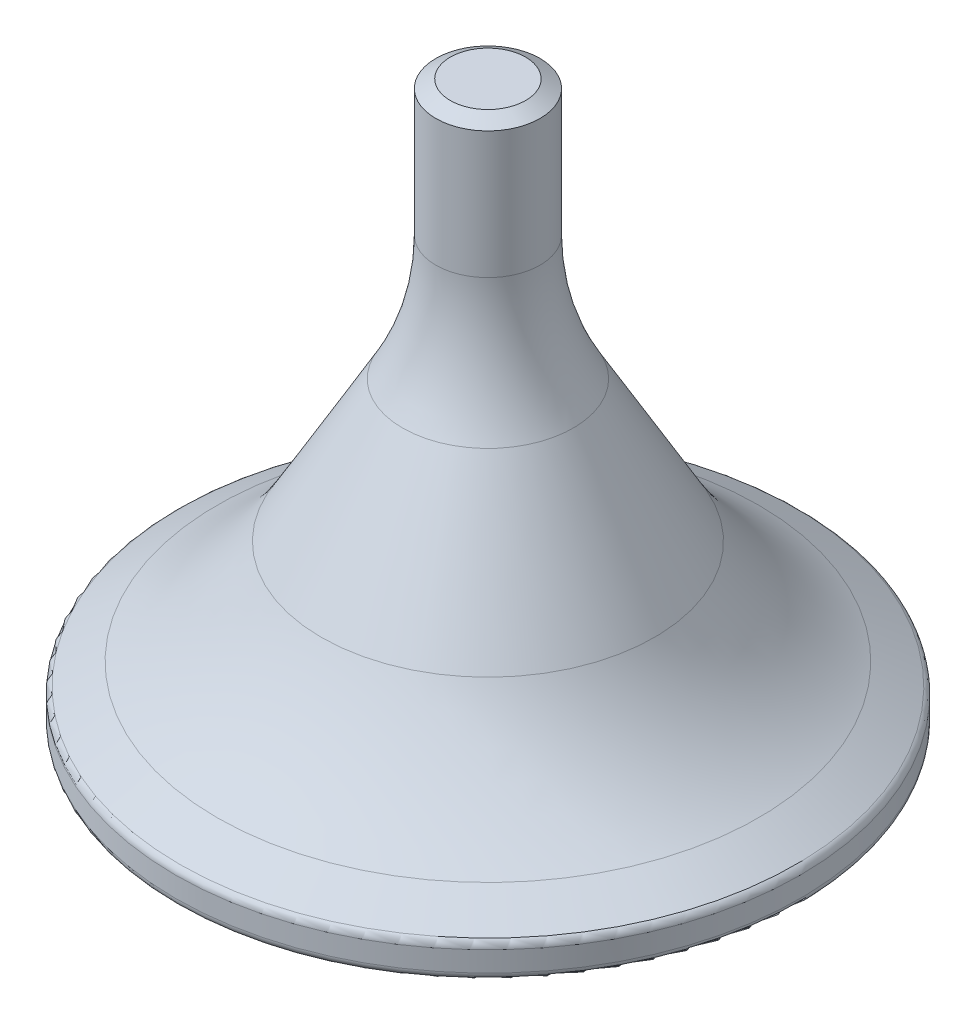
ISO-10303-21;
HEADER;
FILE_DESCRIPTION(('STEP AP214'),'2;1');
FILE_NAME('part.step','',(''),(''),'','','');
FILE_SCHEMA(('AUTOMOTIVE_DESIGN { 1 0 10303 214 1 1 1 1 }'));
ENDSEC;
DATA;
#1=APPLICATION_CONTEXT('core data for automotive mechanical design processes');
#2=APPLICATION_PROTOCOL_DEFINITION('international standard','automotive_design',2000,#1);
#3=PRODUCT_CONTEXT('',#1,'mechanical');
#4=PRODUCT('Part','Part','',(#3));
#5=PRODUCT_RELATED_PRODUCT_CATEGORY('part','',(#4));
#6=PRODUCT_DEFINITION_FORMATION('','',#4);
#7=PRODUCT_DEFINITION_CONTEXT('part definition',#1,'design');
#8=PRODUCT_DEFINITION('design','',#6,#7);
#9=PRODUCT_DEFINITION_SHAPE('','',#8);
#10=(LENGTH_UNIT() NAMED_UNIT(*) SI_UNIT(.MILLI.,.METRE.));
#11=(NAMED_UNIT(*) PLANE_ANGLE_UNIT() SI_UNIT($,.RADIAN.));
#12=(NAMED_UNIT(*) SI_UNIT($,.STERADIAN.) SOLID_ANGLE_UNIT());
#13=UNCERTAINTY_MEASURE_WITH_UNIT(LENGTH_MEASURE(1.E-05),#10,'distance_accuracy_value','');
#14=(GEOMETRIC_REPRESENTATION_CONTEXT(3) GLOBAL_UNCERTAINTY_ASSIGNED_CONTEXT((#13)) GLOBAL_UNIT_ASSIGNED_CONTEXT((#10,
#11,#12)) REPRESENTATION_CONTEXT('',''));
#15=CARTESIAN_POINT('',(0.,0.,0.));
#16=DIRECTION('',(0.,0.,1.));
#17=DIRECTION('',(1.,0.,0.));
#18=AXIS2_PLACEMENT_3D('',#15,#16,#17);
#19=CARTESIAN_POINT('',(0.,-34.2658445746104,-19.05));
#20=DIRECTION('',(0.,1.,0.));
#21=DIRECTION('',(0.,0.,1.));
#22=AXIS2_PLACEMENT_3D('',#19,#20,#21);
#23=PLANE('',#22);
#24=CARTESIAN_POINT('',(-7.9375,-34.2658445746104,0.));
#25=DIRECTION('',(0.,1.,0.));
#26=DIRECTION('',(0.,0.,1.));
#27=AXIS2_PLACEMENT_3D('',#24,#25,#26);
#28=CIRCLE('',#27,1.5875);
#29=CARTESIAN_POINT('',(-7.9375,-34.2658445746104,-1.5875));
#30=VERTEX_POINT('',#29);
#31=CARTESIAN_POINT('',(-9.525,-34.2658445746104,0.));
#32=VERTEX_POINT('',#31);
#33=EDGE_CURVE('E63',#30,#32,#28,.T.);
#34=ORIENTED_EDGE('',*,*,#33,.T.);
#35=CARTESIAN_POINT('',(-7.9375,-34.2658445746104,0.));
#36=DIRECTION('',(0.,1.,0.));
#37=DIRECTION('',(0.,0.,1.));
#38=AXIS2_PLACEMENT_3D('',#35,#36,#37);
#39=CIRCLE('',#38,1.5875);
#40=CARTESIAN_POINT('',(-7.9375,-34.2658445746104,1.5875));
#41=VERTEX_POINT('',#40);
#42=EDGE_CURVE('E11',#32,#41,#39,.T.);
#43=ORIENTED_EDGE('',*,*,#42,.T.);
#44=DIRECTION('',(-1.,0.,0.));
#45=VECTOR('',#44,1.);
#46=CARTESIAN_POINT('',(-9.525,-34.2658445746104,1.5875));
#47=LINE('',#46,#45);
#48=CARTESIAN_POINT('',(7.93749999999999,-34.2658445746104,1.5875));
#49=VERTEX_POINT('',#48);
#50=EDGE_CURVE('E117',#49,#41,#47,.T.);
#51=ORIENTED_EDGE('',*,*,#50,.F.);
#52=CARTESIAN_POINT('',(7.9375,-34.2658445746104,0.));
#53=DIRECTION('',(0.,1.,0.));
#54=DIRECTION('',(0.,0.,1.));
#55=AXIS2_PLACEMENT_3D('',#52,#53,#54);
#56=CIRCLE('',#55,1.5875);
#57=CARTESIAN_POINT('',(9.525,-34.2658445746104,0.));
#58=VERTEX_POINT('',#57);
#59=EDGE_CURVE('E50',#49,#58,#56,.T.);
#60=ORIENTED_EDGE('',*,*,#59,.T.);
#61=CARTESIAN_POINT('',(7.9375,-34.2658445746104,0.));
#62=DIRECTION('',(0.,1.,0.));
#63=DIRECTION('',(0.,0.,1.));
#64=AXIS2_PLACEMENT_3D('',#61,#62,#63);
#65=CIRCLE('',#64,1.5875);
#66=CARTESIAN_POINT('',(7.93749999999999,-34.2658445746104,-1.5875));
#67=VERTEX_POINT('',#66);
#68=EDGE_CURVE('E100',#58,#67,#65,.T.);
#69=ORIENTED_EDGE('',*,*,#68,.T.);
#70=DIRECTION('',(1.,0.,0.));
#71=VECTOR('',#70,1.);
#72=CARTESIAN_POINT('',(-9.525,-34.2658445746104,-1.5875));
#73=LINE('',#72,#71);
#74=EDGE_CURVE('E108',#30,#67,#73,.T.);
#75=ORIENTED_EDGE('',*,*,#74,.F.);
#76=EDGE_LOOP('',(#34,#43,#51,#60,#69,#75));
#77=FACE_BOUND('',#76,.T.);
#78=CARTESIAN_POINT('',(0.,-34.2658445746104,0.));
#79=DIRECTION('',(0.,1.,0.));
#80=DIRECTION('',(0.,0.,1.));
#81=AXIS2_PLACEMENT_3D('',#78,#79,#80);
#82=CIRCLE('',#81,18.542);
#83=CARTESIAN_POINT('',(0.,-34.2658445746104,18.542));
#84=VERTEX_POINT('',#83);
#85=EDGE_CURVE('E143',#84,#84,#82,.F.);
#86=ORIENTED_EDGE('',*,*,#85,.T.);
#87=EDGE_LOOP('',(#86));
#88=FACE_BOUND('',#87,.T.);
#89=ADVANCED_FACE('F41',(#77,#88),#23,.F.);
#90=CARTESIAN_POINT('',(0.,0.,0.));
#91=DIRECTION('',(0.,1.,0.));
#92=DIRECTION('',(0.,0.,1.));
#93=AXIS2_PLACEMENT_3D('',#90,#91,#92);
#94=CYLINDRICAL_SURFACE('',#93,19.05);
#95=CARTESIAN_POINT('',(0.,-33.7578445746104,0.));
#96=DIRECTION('',(0.,1.,0.));
#97=DIRECTION('',(0.,0.,1.));
#98=AXIS2_PLACEMENT_3D('',#95,#96,#97);
#99=CIRCLE('',#98,19.05);
#100=CARTESIAN_POINT('',(0.,-33.7578445746104,19.05));
#101=VERTEX_POINT('',#100);
#102=EDGE_CURVE('E140',#101,#101,#99,.T.);
#103=ORIENTED_EDGE('',*,*,#102,.T.);
#104=EDGE_LOOP('',(#103));
#105=FACE_BOUND('',#104,.T.);
#106=CARTESIAN_POINT('',(0.,-32.5271385113588,0.));
#107=DIRECTION('',(0.,-1.,0.));
#108=DIRECTION('',(0.,0.,-1.));
#109=AXIS2_PLACEMENT_3D('',#106,#107,#108);
#110=CIRCLE('',#109,19.05);
#111=CARTESIAN_POINT('',(0.,-32.5271385113588,-19.05));
#112=VERTEX_POINT('',#111);
#113=EDGE_CURVE('E137',#112,#112,#110,.T.);
#114=ORIENTED_EDGE('',*,*,#113,.T.);
#115=EDGE_LOOP('',(#114));
#116=FACE_BOUND('',#115,.T.);
#117=ADVANCED_FACE('F192',(#105,#116),#94,.T.);
#118=CARTESIAN_POINT('',(0.,-32.2338445746104,0.));
#119=DIRECTION('',(0.,-1.,0.));
#120=DIRECTION('',(0.,0.,-1.));
#121=AXIS2_PLACEMENT_3D('',#118,#119,#120);
#122=CONICAL_SURFACE('',#121,19.05,1.0471975511966);
#123=CARTESIAN_POINT('',(0.,-32.0871976062363,0.));
#124=DIRECTION('',(0.,1.,0.));
#125=DIRECTION('',(0.,0.,1.));
#126=AXIS2_PLACEMENT_3D('',#123,#124,#125);
#127=CIRCLE('',#126,18.796);
#128=CARTESIAN_POINT('',(0.,-32.0871976062363,18.796));
#129=VERTEX_POINT('',#128);
#130=EDGE_CURVE('E146',#129,#129,#127,.T.);
#131=ORIENTED_EDGE('',*,*,#130,.T.);
#132=EDGE_LOOP('',(#131));
#133=FACE_BOUND('',#132,.T.);
#134=CARTESIAN_POINT('',(0.,-30.7673748908688,0.));
#135=DIRECTION('',(0.,1.,0.));
#136=DIRECTION('',(0.,0.,1.));
#137=AXIS2_PLACEMENT_3D('',#134,#135,#136);
#138=CIRCLE('',#137,16.51);
#139=CARTESIAN_POINT('',(0.,-30.7673748908688,16.51));
#140=VERTEX_POINT('',#139);
#141=EDGE_CURVE('E134',#140,#140,#138,.T.);
#142=ORIENTED_EDGE('',*,*,#141,.F.);
#143=EDGE_LOOP('',(#142));
#144=FACE_BOUND('',#143,.T.);
#145=ADVANCED_FACE('F199',(#133,#144),#122,.T.);
#146=CARTESIAN_POINT('',(0.,-15.7431135768379,0.));
#147=DIRECTION('',(0.,1.,0.));
#148=DIRECTION('',(0.,0.,1.));
#149=AXIS2_PLACEMENT_3D('',#146,#147,#148);
#150=TOROIDAL_SURFACE('',#149,25.1842613140309,17.348522628062);
#151=CARTESIAN_POINT('',(0.,-24.4173748908688,0.));
#152=DIRECTION('',(0.,1.,0.));
#153=DIRECTION('',(0.,0.,1.));
#154=AXIS2_PLACEMENT_3D('',#151,#152,#153);
#155=CIRCLE('',#154,10.16);
#156=CARTESIAN_POINT('',(0.,-24.4173748908688,10.16));
#157=VERTEX_POINT('',#156);
#158=EDGE_CURVE('E131',#157,#157,#155,.T.);
#159=ORIENTED_EDGE('',*,*,#158,.F.);
#160=EDGE_LOOP('',(#159));
#161=FACE_BOUND('',#160,.T.);
#162=ORIENTED_EDGE('',*,*,#141,.T.);
#163=EDGE_LOOP('',(#162));
#164=FACE_BOUND('',#163,.T.);
#165=ADVANCED_FACE('F242',(#161,#164),#150,.F.);
#166=CARTESIAN_POINT('',(0.,-24.4173748908688,0.));
#167=DIRECTION('',(0.,-1.,0.));
#168=DIRECTION('',(0.,0.,-1.));
#169=AXIS2_PLACEMENT_3D('',#166,#167,#168);
#170=CONICAL_SURFACE('',#169,10.16,0.523598775598293);
#171=CARTESIAN_POINT('',(0.,-15.83852724098,0.));
#172=DIRECTION('',(0.,1.,0.));
#173=DIRECTION('',(0.,0.,1.));
#174=AXIS2_PLACEMENT_3D('',#171,#172,#173);
#175=CIRCLE('',#174,5.20699999999999);
#176=CARTESIAN_POINT('',(0.,-15.83852724098,5.20699999999999));
#177=VERTEX_POINT('',#176);
#178=EDGE_CURVE('E128',#177,#177,#175,.T.);
#179=ORIENTED_EDGE('',*,*,#178,.F.);
#180=EDGE_LOOP('',(#179));
#181=FACE_BOUND('',#180,.T.);
#182=ORIENTED_EDGE('',*,*,#158,.T.);
#183=EDGE_LOOP('',(#182));
#184=FACE_BOUND('',#183,.T.);
#185=ADVANCED_FACE('F238',(#181,#184),#170,.T.);
#186=CARTESIAN_POINT('',(0.,-8.25499999999998,0.));
#187=DIRECTION('',(0.,1.,0.));
#188=DIRECTION('',(0.,0.,1.));
#189=AXIS2_PLACEMENT_3D('',#186,#187,#188);
#190=TOROIDAL_SURFACE('',#189,18.3420544819603,15.1670544819603);
#191=CARTESIAN_POINT('',(0.,-8.255,0.));
#192=DIRECTION('',(0.,1.,0.));
#193=DIRECTION('',(0.,0.,1.));
#194=AXIS2_PLACEMENT_3D('',#191,#192,#193);
#195=CIRCLE('',#194,3.175);
#196=CARTESIAN_POINT('',(0.,-8.255,3.175));
#197=VERTEX_POINT('',#196);
#198=EDGE_CURVE('E125',#197,#197,#195,.T.);
#199=ORIENTED_EDGE('',*,*,#198,.F.);
#200=EDGE_LOOP('',(#199));
#201=FACE_BOUND('',#200,.T.);
#202=ORIENTED_EDGE('',*,*,#178,.T.);
#203=EDGE_LOOP('',(#202));
#204=FACE_BOUND('',#203,.T.);
#205=ADVANCED_FACE('F231',(#201,#204),#190,.F.);
#206=CARTESIAN_POINT('',(0.,0.,0.));
#207=DIRECTION('',(0.,1.,0.));
#208=DIRECTION('',(0.,0.,1.));
#209=AXIS2_PLACEMENT_3D('',#206,#207,#208);
#210=CYLINDRICAL_SURFACE('',#209,3.175);
#211=CARTESIAN_POINT('',(0.,-0.507999999999998,0.));
#212=DIRECTION('',(0.,-1.,0.));
#213=DIRECTION('',(0.,0.,-1.));
#214=AXIS2_PLACEMENT_3D('',#211,#212,#213);
#215=CIRCLE('',#214,3.175);
#216=CARTESIAN_POINT('',(0.,-0.507999999999998,-3.175));
#217=VERTEX_POINT('',#216);
#218=EDGE_CURVE('E152',#217,#217,#215,.T.);
#219=ORIENTED_EDGE('',*,*,#218,.T.);
#220=EDGE_LOOP('',(#219));
#221=FACE_BOUND('',#220,.T.);
#222=ORIENTED_EDGE('',*,*,#198,.T.);
#223=EDGE_LOOP('',(#222));
#224=FACE_BOUND('',#223,.T.);
#225=ADVANCED_FACE('F226',(#221,#224),#210,.T.);
#226=CARTESIAN_POINT('',(0.,0.,0.));
#227=DIRECTION('',(0.,-1.,0.));
#228=DIRECTION('',(0.,0.,-1.));
#229=AXIS2_PLACEMENT_3D('',#226,#227,#228);
#230=PLANE('',#229);
#231=CARTESIAN_POINT('',(0.,0.,0.));
#232=DIRECTION('',(0.,-1.,0.));
#233=DIRECTION('',(0.,0.,-1.));
#234=AXIS2_PLACEMENT_3D('',#231,#232,#233);
#235=CIRCLE('',#234,2.29511818975501);
#236=CARTESIAN_POINT('',(0.,0.,-2.29511818975501));
#237=VERTEX_POINT('',#236);
#238=EDGE_CURVE('E149',#237,#237,#235,.F.);
#239=ORIENTED_EDGE('',*,*,#238,.T.);
#240=EDGE_LOOP('',(#239));
#241=FACE_BOUND('',#240,.T.);
#242=ADVANCED_FACE('F208',(#241),#230,.F.);
#243=CARTESIAN_POINT('',(0.,-33.7578445746104,0.));
#244=DIRECTION('',(0.,1.,0.));
#245=DIRECTION('',(0.,0.,1.));
#246=AXIS2_PLACEMENT_3D('',#243,#244,#245);
#247=TOROIDAL_SURFACE('',#246,18.542,0.508);
#248=ORIENTED_EDGE('',*,*,#85,.F.);
#249=EDGE_LOOP('',(#248));
#250=FACE_BOUND('',#249,.T.);
#251=ORIENTED_EDGE('',*,*,#102,.F.);
#252=EDGE_LOOP('',(#251));
#253=FACE_BOUND('',#252,.T.);
#254=ADVANCED_FACE('F204',(#250,#253),#247,.T.);
#255=CARTESIAN_POINT('',(0.,-32.5271385113588,0.));
#256=DIRECTION('',(0.,-1.,0.));
#257=DIRECTION('',(0.,0.,-1.));
#258=AXIS2_PLACEMENT_3D('',#255,#256,#257);
#259=TOROIDAL_SURFACE('',#258,18.542,0.508);
#260=ORIENTED_EDGE('',*,*,#113,.F.);
#261=EDGE_LOOP('',(#260));
#262=FACE_BOUND('',#261,.T.);
#263=ORIENTED_EDGE('',*,*,#130,.F.);
#264=EDGE_LOOP('',(#263));
#265=FACE_BOUND('',#264,.T.);
#266=ADVANCED_FACE('F207',(#262,#265),#259,.T.);
#267=CARTESIAN_POINT('',(0.,0.,0.));
#268=DIRECTION('',(0.,-1.,0.));
#269=DIRECTION('',(0.,0.,-1.));
#270=AXIS2_PLACEMENT_3D('',#267,#268,#269);
#271=CONICAL_SURFACE('',#270,2.29511818975501,1.0471975511966);
#272=ORIENTED_EDGE('',*,*,#218,.F.);
#273=EDGE_LOOP('',(#272));
#274=FACE_BOUND('',#273,.T.);
#275=ORIENTED_EDGE('',*,*,#238,.F.);
#276=EDGE_LOOP('',(#275));
#277=FACE_BOUND('',#276,.T.);
#278=ADVANCED_FACE('F212',(#274,#277),#271,.T.);
#279=CARTESIAN_POINT('',(-9.525,-29.5033445746104,1.5875));
#280=DIRECTION('',(0.,0.,1.));
#281=DIRECTION('',(1.,0.,0.));
#282=AXIS2_PLACEMENT_3D('',#279,#280,#281);
#283=PLANE('',#282);
#284=DIRECTION('',(-1.,0.,0.));
#285=VECTOR('',#284,1.);
#286=CARTESIAN_POINT('',(-9.525,-29.5033445746104,1.5875));
#287=LINE('',#286,#285);
#288=CARTESIAN_POINT('',(7.93749999999999,-29.5033445746104,1.5875));
#289=VERTEX_POINT('',#288);
#290=CARTESIAN_POINT('',(-7.9375,-29.5033445746104,1.5875));
#291=VERTEX_POINT('',#290);
#292=EDGE_CURVE('E122',#289,#291,#287,.T.);
#293=ORIENTED_EDGE('',*,*,#292,.F.);
#294=DIRECTION('',(0.,-1.,0.));
#295=VECTOR('',#294,1.);
#296=CARTESIAN_POINT('',(7.9375,-34.2658445746104,1.5875));
#297=LINE('',#296,#295);
#298=EDGE_CURVE('E101',#289,#49,#297,.T.);
#299=ORIENTED_EDGE('',*,*,#298,.T.);
#300=ORIENTED_EDGE('',*,*,#50,.T.);
#301=DIRECTION('',(0.,-1.,0.));
#302=VECTOR('',#301,1.);
#303=CARTESIAN_POINT('',(-7.9375,-29.5033445746104,1.5875));
#304=LINE('',#303,#302);
#305=EDGE_CURVE('E163',#41,#291,#304,.F.);
#306=ORIENTED_EDGE('',*,*,#305,.T.);
#307=EDGE_LOOP('',(#293,#299,#300,#306));
#308=FACE_BOUND('',#307,.T.);
#309=ADVANCED_FACE('F170',(#308),#283,.F.);
#310=CARTESIAN_POINT('',(-9.525,-29.5033445746104,-1.5875));
#311=DIRECTION('',(0.,0.,-1.));
#312=DIRECTION('',(-1.,0.,0.));
#313=AXIS2_PLACEMENT_3D('',#310,#311,#312);
#314=PLANE('',#313);
#315=DIRECTION('',(1.,0.,0.));
#316=VECTOR('',#315,1.);
#317=CARTESIAN_POINT('',(-9.525,-29.5033445746104,-1.5875));
#318=LINE('',#317,#316);
#319=CARTESIAN_POINT('',(-7.9375,-29.5033445746104,-1.5875));
#320=VERTEX_POINT('',#319);
#321=CARTESIAN_POINT('',(7.93749999999999,-29.5033445746104,-1.5875));
#322=VERTEX_POINT('',#321);
#323=EDGE_CURVE('E111',#320,#322,#318,.T.);
#324=ORIENTED_EDGE('',*,*,#323,.F.);
#325=DIRECTION('',(0.,-1.,0.));
#326=VECTOR('',#325,1.);
#327=CARTESIAN_POINT('',(-7.9375,-34.2658445746104,-1.5875));
#328=LINE('',#327,#326);
#329=EDGE_CURVE('E97',#320,#30,#328,.T.);
#330=ORIENTED_EDGE('',*,*,#329,.T.);
#331=ORIENTED_EDGE('',*,*,#74,.T.);
#332=DIRECTION('',(0.,-1.,0.));
#333=VECTOR('',#332,1.);
#334=CARTESIAN_POINT('',(7.9375,-29.5033445746104,-1.5875));
#335=LINE('',#334,#333);
#336=EDGE_CURVE('E113',#67,#322,#335,.F.);
#337=ORIENTED_EDGE('',*,*,#336,.T.);
#338=EDGE_LOOP('',(#324,#330,#331,#337));
#339=FACE_BOUND('',#338,.T.);
#340=ADVANCED_FACE('F106',(#339),#314,.F.);
#341=CARTESIAN_POINT('',(0.,-29.5033445746104,0.));
#342=DIRECTION('',(0.,-1.,0.));
#343=DIRECTION('',(0.,0.,-1.));
#344=AXIS2_PLACEMENT_3D('',#341,#342,#343);
#345=PLANE('',#344);
#346=ORIENTED_EDGE('',*,*,#323,.T.);
#347=CARTESIAN_POINT('',(7.9375,-29.5033445746104,0.));
#348=DIRECTION('',(0.,-1.,0.));
#349=DIRECTION('',(0.,0.,-1.));
#350=AXIS2_PLACEMENT_3D('',#347,#348,#349);
#351=CIRCLE('',#350,1.5875);
#352=CARTESIAN_POINT('',(9.525,-29.5033445746104,0.));
#353=VERTEX_POINT('',#352);
#354=EDGE_CURVE('E161',#322,#353,#351,.T.);
#355=ORIENTED_EDGE('',*,*,#354,.T.);
#356=CARTESIAN_POINT('',(7.9375,-29.5033445746104,0.));
#357=DIRECTION('',(0.,-1.,0.));
#358=DIRECTION('',(0.,0.,-1.));
#359=AXIS2_PLACEMENT_3D('',#356,#357,#358);
#360=CIRCLE('',#359,1.5875);
#361=EDGE_CURVE('E159',#353,#289,#360,.T.);
#362=ORIENTED_EDGE('',*,*,#361,.T.);
#363=ORIENTED_EDGE('',*,*,#292,.T.);
#364=CARTESIAN_POINT('',(-7.9375,-29.5033445746104,0.));
#365=DIRECTION('',(0.,-1.,0.));
#366=DIRECTION('',(0.,0.,-1.));
#367=AXIS2_PLACEMENT_3D('',#364,#365,#366);
#368=CIRCLE('',#367,1.5875);
#369=CARTESIAN_POINT('',(-9.525,-29.5033445746104,0.));
#370=VERTEX_POINT('',#369);
#371=EDGE_CURVE('E112',#291,#370,#368,.T.);
#372=ORIENTED_EDGE('',*,*,#371,.T.);
#373=CARTESIAN_POINT('',(-7.9375,-29.5033445746104,0.));
#374=DIRECTION('',(0.,-1.,0.));
#375=DIRECTION('',(0.,0.,-1.));
#376=AXIS2_PLACEMENT_3D('',#373,#374,#375);
#377=CIRCLE('',#376,1.5875);
#378=EDGE_CURVE('E157',#370,#320,#377,.T.);
#379=ORIENTED_EDGE('',*,*,#378,.T.);
#380=EDGE_LOOP('',(#346,#355,#362,#363,#372,#379));
#381=FACE_BOUND('',#380,.T.);
#382=ADVANCED_FACE('F179',(#381),#345,.T.);
#383=CARTESIAN_POINT('',(-7.9375,-29.5033445746104,0.));
#384=DIRECTION('',(0.,1.,0.));
#385=DIRECTION('',(0.,0.,1.));
#386=AXIS2_PLACEMENT_3D('',#383,#384,#385);
#387=CYLINDRICAL_SURFACE('',#386,1.5875);
#388=DIRECTION('',(0.,-1.,0.));
#389=VECTOR('',#388,1.);
#390=CARTESIAN_POINT('',(-9.525,-34.2658445746104,0.));
#391=LINE('',#390,#389);
#392=EDGE_CURVE('E99',#370,#32,#391,.T.);
#393=ORIENTED_EDGE('',*,*,#392,.F.);
#394=ORIENTED_EDGE('',*,*,#371,.F.);
#395=ORIENTED_EDGE('',*,*,#305,.F.);
#396=ORIENTED_EDGE('',*,*,#42,.F.);
#397=EDGE_LOOP('',(#393,#394,#395,#396));
#398=FACE_BOUND('',#397,.T.);
#399=ADVANCED_FACE('F182',(#398),#387,.F.);
#400=CARTESIAN_POINT('',(-7.9375,-29.5033445746104,0.));
#401=DIRECTION('',(0.,1.,0.));
#402=DIRECTION('',(0.,0.,1.));
#403=AXIS2_PLACEMENT_3D('',#400,#401,#402);
#404=CYLINDRICAL_SURFACE('',#403,1.5875);
#405=ORIENTED_EDGE('',*,*,#378,.F.);
#406=ORIENTED_EDGE('',*,*,#392,.T.);
#407=ORIENTED_EDGE('',*,*,#33,.F.);
#408=ORIENTED_EDGE('',*,*,#329,.F.);
#409=EDGE_LOOP('',(#405,#406,#407,#408));
#410=FACE_BOUND('',#409,.T.);
#411=ADVANCED_FACE('F96',(#410),#404,.F.);
#412=CARTESIAN_POINT('',(7.9375,-29.5033445746104,0.));
#413=DIRECTION('',(0.,1.,0.));
#414=DIRECTION('',(0.,0.,1.));
#415=AXIS2_PLACEMENT_3D('',#412,#413,#414);
#416=CYLINDRICAL_SURFACE('',#415,1.5875);
#417=ORIENTED_EDGE('',*,*,#298,.F.);
#418=ORIENTED_EDGE('',*,*,#361,.F.);
#419=DIRECTION('',(0.,-1.,0.));
#420=VECTOR('',#419,1.);
#421=CARTESIAN_POINT('',(9.525,-29.5033445746104,0.));
#422=LINE('',#421,#420);
#423=EDGE_CURVE('E45',#58,#353,#422,.F.);
#424=ORIENTED_EDGE('',*,*,#423,.F.);
#425=ORIENTED_EDGE('',*,*,#59,.F.);
#426=EDGE_LOOP('',(#417,#418,#424,#425));
#427=FACE_BOUND('',#426,.T.);
#428=ADVANCED_FACE('F43',(#427),#416,.F.);
#429=CARTESIAN_POINT('',(7.9375,-29.5033445746104,0.));
#430=DIRECTION('',(0.,1.,0.));
#431=DIRECTION('',(0.,0.,1.));
#432=AXIS2_PLACEMENT_3D('',#429,#430,#431);
#433=CYLINDRICAL_SURFACE('',#432,1.5875);
#434=ORIENTED_EDGE('',*,*,#354,.F.);
#435=ORIENTED_EDGE('',*,*,#336,.F.);
#436=ORIENTED_EDGE('',*,*,#68,.F.);
#437=ORIENTED_EDGE('',*,*,#423,.T.);
#438=EDGE_LOOP('',(#434,#435,#436,#437));
#439=FACE_BOUND('',#438,.T.);
#440=ADVANCED_FACE('F177',(#439),#433,.F.);
#441=CLOSED_SHELL('',(#89,#117,#145,#165,#185,#205,#225,#242,#254,#266,#278,#309,#340,#382,#399,
#411,#428,#440));
#442=MANIFOLD_SOLID_BREP('B2',#441);
#443=ADVANCED_BREP_SHAPE_REPRESENTATION('',(#18,#442),#14);
#444=SHAPE_DEFINITION_REPRESENTATION(#9,#443);
ENDSEC;
END-ISO-10303-21;
